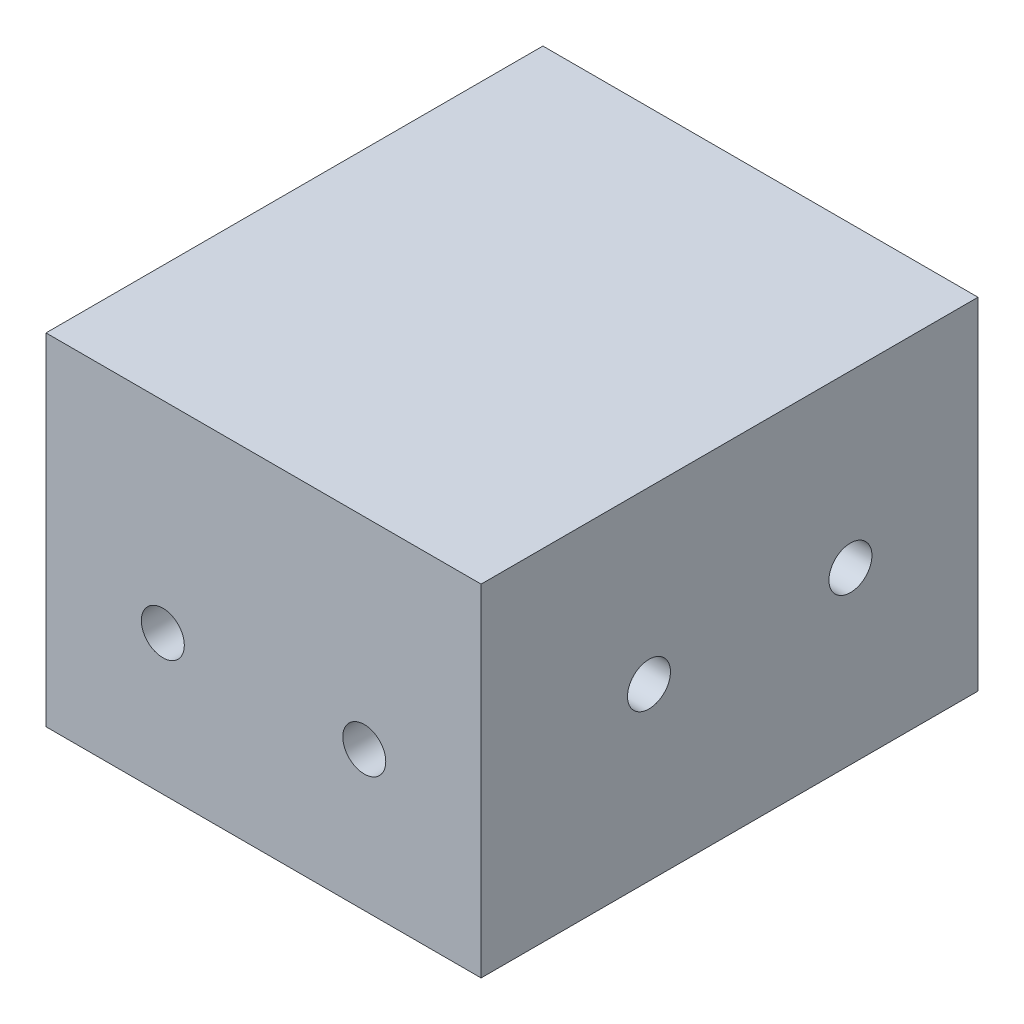
ISO-10303-21;
HEADER;
FILE_DESCRIPTION(('STEP AP214'),'2;1');
FILE_NAME('part.step','',(''),(''),'','','');
FILE_SCHEMA(('AUTOMOTIVE_DESIGN { 1 0 10303 214 1 1 1 1 }'));
ENDSEC;
DATA;
#1=APPLICATION_CONTEXT('core data for automotive mechanical design processes');
#2=APPLICATION_PROTOCOL_DEFINITION('international standard','automotive_design',2000,#1);
#3=PRODUCT_CONTEXT('',#1,'mechanical');
#4=PRODUCT('Part','Part','',(#3));
#5=PRODUCT_RELATED_PRODUCT_CATEGORY('part','',(#4));
#6=PRODUCT_DEFINITION_FORMATION('','',#4);
#7=PRODUCT_DEFINITION_CONTEXT('part definition',#1,'design');
#8=PRODUCT_DEFINITION('design','',#6,#7);
#9=PRODUCT_DEFINITION_SHAPE('','',#8);
#10=(LENGTH_UNIT() NAMED_UNIT(*) SI_UNIT(.MILLI.,.METRE.));
#11=(NAMED_UNIT(*) PLANE_ANGLE_UNIT() SI_UNIT($,.RADIAN.));
#12=(NAMED_UNIT(*) SI_UNIT($,.STERADIAN.) SOLID_ANGLE_UNIT());
#13=UNCERTAINTY_MEASURE_WITH_UNIT(LENGTH_MEASURE(1.E-05),#10,'distance_accuracy_value','');
#14=(GEOMETRIC_REPRESENTATION_CONTEXT(3) GLOBAL_UNCERTAINTY_ASSIGNED_CONTEXT((#13)) GLOBAL_UNIT_ASSIGNED_CONTEXT((#10,
#11,#12)) REPRESENTATION_CONTEXT('',''));
#15=CARTESIAN_POINT('',(0.,0.,0.));
#16=DIRECTION('',(0.,0.,1.));
#17=DIRECTION('',(1.,0.,0.));
#18=AXIS2_PLACEMENT_3D('',#15,#16,#17);
#19=CARTESIAN_POINT('',(23.7,10.4,-0.001000000000001));
#20=DIRECTION('',(0.,0.,1.));
#21=DIRECTION('',(1.,0.,0.));
#22=AXIS2_PLACEMENT_3D('',#19,#20,#21);
#23=CYLINDRICAL_SURFACE('',#22,1.6);
#24=CARTESIAN_POINT('',(23.7,10.4,33.));
#25=DIRECTION('',(0.,0.,-1.));
#26=DIRECTION('',(-1.,0.,0.));
#27=AXIS2_PLACEMENT_3D('',#24,#25,#26);
#28=CIRCLE('',#27,1.6);
#29=CARTESIAN_POINT('',(22.1,10.4,33.));
#30=VERTEX_POINT('',#29);
#31=EDGE_CURVE('E69',#30,#30,#28,.F.);
#32=ORIENTED_EDGE('',*,*,#31,.F.);
#33=EDGE_LOOP('',(#32));
#34=FACE_BOUND('',#33,.T.);
#35=CARTESIAN_POINT('',(23.7,10.4,37.));
#36=DIRECTION('',(0.,0.,1.));
#37=DIRECTION('',(1.,0.,0.));
#38=AXIS2_PLACEMENT_3D('',#35,#36,#37);
#39=CIRCLE('',#38,1.6);
#40=CARTESIAN_POINT('',(25.3,10.4,37.));
#41=VERTEX_POINT('',#40);
#42=EDGE_CURVE('E233',#41,#41,#39,.T.);
#43=ORIENTED_EDGE('',*,*,#42,.T.);
#44=EDGE_LOOP('',(#43));
#45=FACE_BOUND('',#44,.T.);
#46=ADVANCED_FACE('F65',(#34,#45),#23,.F.);
#47=CARTESIAN_POINT('',(8.7,10.4,-0.001000000000001));
#48=DIRECTION('',(0.,0.,1.));
#49=DIRECTION('',(1.,0.,0.));
#50=AXIS2_PLACEMENT_3D('',#47,#48,#49);
#51=CYLINDRICAL_SURFACE('',#50,1.6);
#52=CARTESIAN_POINT('',(8.7,10.4,33.));
#53=DIRECTION('',(0.,0.,-1.));
#54=DIRECTION('',(-1.,0.,0.));
#55=AXIS2_PLACEMENT_3D('',#52,#53,#54);
#56=CIRCLE('',#55,1.6);
#57=CARTESIAN_POINT('',(7.1,10.4,33.));
#58=VERTEX_POINT('',#57);
#59=EDGE_CURVE('E322',#58,#58,#56,.F.);
#60=ORIENTED_EDGE('',*,*,#59,.F.);
#61=EDGE_LOOP('',(#60));
#62=FACE_BOUND('',#61,.T.);
#63=CARTESIAN_POINT('',(8.7,10.4,37.));
#64=DIRECTION('',(0.,0.,1.));
#65=DIRECTION('',(1.,0.,0.));
#66=AXIS2_PLACEMENT_3D('',#63,#64,#65);
#67=CIRCLE('',#66,1.6);
#68=CARTESIAN_POINT('',(10.3,10.4,37.));
#69=VERTEX_POINT('',#68);
#70=EDGE_CURVE('E230',#69,#69,#67,.T.);
#71=ORIENTED_EDGE('',*,*,#70,.T.);
#72=EDGE_LOOP('',(#71));
#73=FACE_BOUND('',#72,.T.);
#74=ADVANCED_FACE('F399',(#62,#73),#51,.F.);
#75=CARTESIAN_POINT('',(0.,0.,35.));
#76=DIRECTION('',(0.,1.,0.));
#77=DIRECTION('',(0.,0.,1.));
#78=AXIS2_PLACEMENT_3D('',#75,#76,#77);
#79=PLANE('',#78);
#80=DIRECTION('',(1.,0.,0.));
#81=VECTOR('',#80,1.);
#82=CARTESIAN_POINT('',(0.,0.,0.));
#83=LINE('',#82,#81);
#84=CARTESIAN_POINT('',(0.,0.,0.));
#85=VERTEX_POINT('',#84);
#86=CARTESIAN_POINT('',(32.4,0.,0.));
#87=VERTEX_POINT('',#86);
#88=EDGE_CURVE('E384',#85,#87,#83,.T.);
#89=ORIENTED_EDGE('',*,*,#88,.T.);
#90=DIRECTION('',(0.,0.,-1.));
#91=VECTOR('',#90,1.);
#92=CARTESIAN_POINT('',(32.4,0.,35.));
#93=LINE('',#92,#91);
#94=CARTESIAN_POINT('',(32.4,0.,37.));
#95=VERTEX_POINT('',#94);
#96=EDGE_CURVE('E74',#95,#87,#93,.T.);
#97=ORIENTED_EDGE('',*,*,#96,.F.);
#98=DIRECTION('',(1.,0.,0.));
#99=VECTOR('',#98,1.);
#100=CARTESIAN_POINT('',(0.,0.,37.));
#101=LINE('',#100,#99);
#102=CARTESIAN_POINT('',(0.,0.,37.));
#103=VERTEX_POINT('',#102);
#104=EDGE_CURVE('E229',#103,#95,#101,.T.);
#105=ORIENTED_EDGE('',*,*,#104,.F.);
#106=DIRECTION('',(0.,0.,-1.));
#107=VECTOR('',#106,1.);
#108=CARTESIAN_POINT('',(0.,0.,35.));
#109=LINE('',#108,#107);
#110=EDGE_CURVE('E12',#103,#85,#109,.T.);
#111=ORIENTED_EDGE('',*,*,#110,.T.);
#112=EDGE_LOOP('',(#89,#97,#105,#111));
#113=FACE_BOUND('',#112,.T.);
#114=DIRECTION('',(1.,0.,0.));
#115=VECTOR('',#114,1.);
#116=CARTESIAN_POINT('',(0.,0.,4.));
#117=LINE('',#116,#115);
#118=CARTESIAN_POINT('',(4.,0.,4.));
#119=VERTEX_POINT('',#118);
#120=CARTESIAN_POINT('',(28.4,0.,4.));
#121=VERTEX_POINT('',#120);
#122=EDGE_CURVE('E355',#119,#121,#117,.T.);
#123=ORIENTED_EDGE('',*,*,#122,.F.);
#124=DIRECTION('',(0.,0.,-1.));
#125=VECTOR('',#124,1.);
#126=CARTESIAN_POINT('',(4.,0.,35.));
#127=LINE('',#126,#125);
#128=CARTESIAN_POINT('',(4.,0.,31.));
#129=VERTEX_POINT('',#128);
#130=EDGE_CURVE('E374',#129,#119,#127,.T.);
#131=ORIENTED_EDGE('',*,*,#130,.F.);
#132=DIRECTION('',(1.,0.,0.));
#133=VECTOR('',#132,1.);
#134=CARTESIAN_POINT('',(0.,0.,31.));
#135=LINE('',#134,#133);
#136=CARTESIAN_POINT('',(28.4,0.,31.));
#137=VERTEX_POINT('',#136);
#138=EDGE_CURVE('E358',#129,#137,#135,.T.);
#139=ORIENTED_EDGE('',*,*,#138,.T.);
#140=DIRECTION('',(0.,0.,-1.));
#141=VECTOR('',#140,1.);
#142=CARTESIAN_POINT('',(28.4,0.,35.));
#143=LINE('',#142,#141);
#144=EDGE_CURVE('E371',#137,#121,#143,.T.);
#145=ORIENTED_EDGE('',*,*,#144,.T.);
#146=EDGE_LOOP('',(#123,#131,#139,#145));
#147=FACE_BOUND('',#146,.T.);
#148=ADVANCED_FACE('F402',(#113,#147),#79,.F.);
#149=CARTESIAN_POINT('',(0.,0.,35.));
#150=DIRECTION('',(1.,0.,0.));
#151=DIRECTION('',(0.,0.,-1.));
#152=AXIS2_PLACEMENT_3D('',#149,#150,#151);
#153=PLANE('',#152);
#154=CARTESIAN_POINT('',(0.,12.7,9.5));
#155=DIRECTION('',(1.,0.,0.));
#156=DIRECTION('',(0.,0.,-1.));
#157=AXIS2_PLACEMENT_3D('',#154,#155,#156);
#158=CIRCLE('',#157,1.6);
#159=CARTESIAN_POINT('',(0.,12.7,7.9));
#160=VERTEX_POINT('',#159);
#161=EDGE_CURVE('E332',#160,#160,#158,.T.);
#162=ORIENTED_EDGE('',*,*,#161,.T.);
#163=EDGE_LOOP('',(#162));
#164=FACE_BOUND('',#163,.T.);
#165=CARTESIAN_POINT('',(0.,12.7,24.5));
#166=DIRECTION('',(1.,0.,0.));
#167=DIRECTION('',(0.,0.,-1.));
#168=AXIS2_PLACEMENT_3D('',#165,#166,#167);
#169=CIRCLE('',#168,1.6);
#170=CARTESIAN_POINT('',(0.,12.7,22.9));
#171=VERTEX_POINT('',#170);
#172=EDGE_CURVE('E343',#171,#171,#169,.T.);
#173=ORIENTED_EDGE('',*,*,#172,.T.);
#174=EDGE_LOOP('',(#173));
#175=FACE_BOUND('',#174,.T.);
#176=DIRECTION('',(0.,-1.,0.));
#177=VECTOR('',#176,1.);
#178=CARTESIAN_POINT('',(0.,0.,0.));
#179=LINE('',#178,#177);
#180=CARTESIAN_POINT('',(0.,25.4,0.));
#181=VERTEX_POINT('',#180);
#182=EDGE_CURVE('E376',#181,#85,#179,.T.);
#183=ORIENTED_EDGE('',*,*,#182,.T.);
#184=ORIENTED_EDGE('',*,*,#110,.F.);
#185=DIRECTION('',(0.,-1.,0.));
#186=VECTOR('',#185,1.);
#187=CARTESIAN_POINT('',(0.,25.4,37.));
#188=LINE('',#187,#186);
#189=CARTESIAN_POINT('',(0.,25.4,37.));
#190=VERTEX_POINT('',#189);
#191=EDGE_CURVE('E223',#190,#103,#188,.T.);
#192=ORIENTED_EDGE('',*,*,#191,.F.);
#193=DIRECTION('',(0.,0.,-1.));
#194=VECTOR('',#193,1.);
#195=CARTESIAN_POINT('',(0.,25.4,35.));
#196=LINE('',#195,#194);
#197=EDGE_CURVE('E214',#190,#181,#196,.T.);
#198=ORIENTED_EDGE('',*,*,#197,.T.);
#199=EDGE_LOOP('',(#183,#184,#192,#198));
#200=FACE_BOUND('',#199,.T.);
#201=ADVANCED_FACE('F67',(#164,#175,#200),#153,.F.);
#202=CARTESIAN_POINT('',(32.4,0.,35.));
#203=DIRECTION('',(-1.,0.,0.));
#204=DIRECTION('',(0.,0.,1.));
#205=AXIS2_PLACEMENT_3D('',#202,#203,#204);
#206=PLANE('',#205);
#207=CARTESIAN_POINT('',(32.4,12.7,9.5));
#208=DIRECTION('',(1.,0.,0.));
#209=DIRECTION('',(0.,0.,-1.));
#210=AXIS2_PLACEMENT_3D('',#207,#208,#209);
#211=CIRCLE('',#210,1.6);
#212=CARTESIAN_POINT('',(32.4,12.7,7.9));
#213=VERTEX_POINT('',#212);
#214=EDGE_CURVE('E336',#213,#213,#211,.T.);
#215=ORIENTED_EDGE('',*,*,#214,.F.);
#216=EDGE_LOOP('',(#215));
#217=FACE_BOUND('',#216,.T.);
#218=CARTESIAN_POINT('',(32.4,12.7,24.5));
#219=DIRECTION('',(1.,0.,0.));
#220=DIRECTION('',(0.,0.,-1.));
#221=AXIS2_PLACEMENT_3D('',#218,#219,#220);
#222=CIRCLE('',#221,1.6);
#223=CARTESIAN_POINT('',(32.4,12.7,22.9));
#224=VERTEX_POINT('',#223);
#225=EDGE_CURVE('E342',#224,#224,#222,.T.);
#226=ORIENTED_EDGE('',*,*,#225,.F.);
#227=EDGE_LOOP('',(#226));
#228=FACE_BOUND('',#227,.T.);
#229=DIRECTION('',(0.,1.,0.));
#230=VECTOR('',#229,1.);
#231=CARTESIAN_POINT('',(32.4,0.,0.));
#232=LINE('',#231,#230);
#233=CARTESIAN_POINT('',(32.4,25.4,0.));
#234=VERTEX_POINT('',#233);
#235=EDGE_CURVE('E211',#87,#234,#232,.T.);
#236=ORIENTED_EDGE('',*,*,#235,.T.);
#237=DIRECTION('',(0.,0.,-1.));
#238=VECTOR('',#237,1.);
#239=CARTESIAN_POINT('',(32.4,25.4,35.));
#240=LINE('',#239,#238);
#241=CARTESIAN_POINT('',(32.4,25.4,37.));
#242=VERTEX_POINT('',#241);
#243=EDGE_CURVE('E204',#242,#234,#240,.T.);
#244=ORIENTED_EDGE('',*,*,#243,.F.);
#245=DIRECTION('',(0.,1.,0.));
#246=VECTOR('',#245,1.);
#247=CARTESIAN_POINT('',(32.4,0.,37.));
#248=LINE('',#247,#246);
#249=EDGE_CURVE('E209',#95,#242,#248,.T.);
#250=ORIENTED_EDGE('',*,*,#249,.F.);
#251=ORIENTED_EDGE('',*,*,#96,.T.);
#252=EDGE_LOOP('',(#236,#244,#250,#251));
#253=FACE_BOUND('',#252,.T.);
#254=ADVANCED_FACE('F206',(#217,#228,#253),#206,.F.);
#255=CARTESIAN_POINT('',(0.,25.4,35.));
#256=DIRECTION('',(0.,-1.,0.));
#257=DIRECTION('',(0.,0.,-1.));
#258=AXIS2_PLACEMENT_3D('',#255,#256,#257);
#259=PLANE('',#258);
#260=DIRECTION('',(-1.,0.,0.));
#261=VECTOR('',#260,1.);
#262=CARTESIAN_POINT('',(0.,25.4,0.));
#263=LINE('',#262,#261);
#264=EDGE_CURVE('E387',#234,#181,#263,.T.);
#265=ORIENTED_EDGE('',*,*,#264,.T.);
#266=ORIENTED_EDGE('',*,*,#197,.F.);
#267=DIRECTION('',(-1.,0.,0.));
#268=VECTOR('',#267,1.);
#269=CARTESIAN_POINT('',(32.4,25.4,37.));
#270=LINE('',#269,#268);
#271=EDGE_CURVE('E217',#242,#190,#270,.T.);
#272=ORIENTED_EDGE('',*,*,#271,.F.);
#273=ORIENTED_EDGE('',*,*,#243,.T.);
#274=EDGE_LOOP('',(#265,#266,#272,#273));
#275=FACE_BOUND('',#274,.T.);
#276=ADVANCED_FACE('F218',(#275),#259,.F.);
#277=CARTESIAN_POINT('',(0.,0.,0.));
#278=DIRECTION('',(0.,0.,-1.));
#279=DIRECTION('',(-1.,0.,0.));
#280=AXIS2_PLACEMENT_3D('',#277,#278,#279);
#281=PLANE('',#280);
#282=ORIENTED_EDGE('',*,*,#182,.F.);
#283=ORIENTED_EDGE('',*,*,#264,.F.);
#284=ORIENTED_EDGE('',*,*,#235,.F.);
#285=ORIENTED_EDGE('',*,*,#88,.F.);
#286=EDGE_LOOP('',(#282,#283,#284,#285));
#287=FACE_BOUND('',#286,.T.);
#288=ADVANCED_FACE('F442',(#287),#281,.T.);
#289=CARTESIAN_POINT('',(4.,0.,35.));
#290=DIRECTION('',(1.,0.,0.));
#291=DIRECTION('',(0.,0.,-1.));
#292=AXIS2_PLACEMENT_3D('',#289,#290,#291);
#293=PLANE('',#292);
#294=CARTESIAN_POINT('',(4.,12.7,9.5));
#295=DIRECTION('',(1.,0.,0.));
#296=DIRECTION('',(0.,0.,-1.));
#297=AXIS2_PLACEMENT_3D('',#294,#295,#296);
#298=CIRCLE('',#297,1.6);
#299=CARTESIAN_POINT('',(4.,12.7,7.9));
#300=VERTEX_POINT('',#299);
#301=EDGE_CURVE('E339',#300,#300,#298,.T.);
#302=ORIENTED_EDGE('',*,*,#301,.F.);
#303=EDGE_LOOP('',(#302));
#304=FACE_BOUND('',#303,.T.);
#305=CARTESIAN_POINT('',(4.,12.7,24.5));
#306=DIRECTION('',(1.,0.,0.));
#307=DIRECTION('',(0.,0.,-1.));
#308=AXIS2_PLACEMENT_3D('',#305,#306,#307);
#309=CIRCLE('',#308,1.6);
#310=CARTESIAN_POINT('',(4.,12.7,22.9));
#311=VERTEX_POINT('',#310);
#312=EDGE_CURVE('E349',#311,#311,#309,.T.);
#313=ORIENTED_EDGE('',*,*,#312,.F.);
#314=EDGE_LOOP('',(#313));
#315=FACE_BOUND('',#314,.T.);
#316=DIRECTION('',(0.,-1.,0.));
#317=VECTOR('',#316,1.);
#318=CARTESIAN_POINT('',(4.,0.,4.));
#319=LINE('',#318,#317);
#320=CARTESIAN_POINT('',(4.,21.4,4.));
#321=VERTEX_POINT('',#320);
#322=EDGE_CURVE('E352',#321,#119,#319,.T.);
#323=ORIENTED_EDGE('',*,*,#322,.F.);
#324=DIRECTION('',(0.,0.,-1.));
#325=VECTOR('',#324,1.);
#326=CARTESIAN_POINT('',(4.,21.4,35.));
#327=LINE('',#326,#325);
#328=CARTESIAN_POINT('',(4.,21.4,31.));
#329=VERTEX_POINT('',#328);
#330=EDGE_CURVE('E360',#329,#321,#327,.T.);
#331=ORIENTED_EDGE('',*,*,#330,.F.);
#332=DIRECTION('',(0.,-1.,0.));
#333=VECTOR('',#332,1.);
#334=CARTESIAN_POINT('',(4.,0.,31.));
#335=LINE('',#334,#333);
#336=EDGE_CURVE('E356',#329,#129,#335,.T.);
#337=ORIENTED_EDGE('',*,*,#336,.T.);
#338=ORIENTED_EDGE('',*,*,#130,.T.);
#339=EDGE_LOOP('',(#323,#331,#337,#338));
#340=FACE_BOUND('',#339,.T.);
#341=ADVANCED_FACE('F438',(#304,#315,#340),#293,.T.);
#342=CARTESIAN_POINT('',(28.4,0.,35.));
#343=DIRECTION('',(-1.,0.,0.));
#344=DIRECTION('',(0.,0.,1.));
#345=AXIS2_PLACEMENT_3D('',#342,#343,#344);
#346=PLANE('',#345);
#347=CARTESIAN_POINT('',(28.4,12.7,9.5));
#348=DIRECTION('',(-1.,0.,0.));
#349=DIRECTION('',(0.,0.,1.));
#350=AXIS2_PLACEMENT_3D('',#347,#348,#349);
#351=CIRCLE('',#350,1.6);
#352=CARTESIAN_POINT('',(28.4,12.7,11.1));
#353=VERTEX_POINT('',#352);
#354=EDGE_CURVE('E335',#353,#353,#351,.T.);
#355=ORIENTED_EDGE('',*,*,#354,.F.);
#356=EDGE_LOOP('',(#355));
#357=FACE_BOUND('',#356,.T.);
#358=CARTESIAN_POINT('',(28.4,12.7,24.5));
#359=DIRECTION('',(-1.,0.,0.));
#360=DIRECTION('',(0.,0.,1.));
#361=AXIS2_PLACEMENT_3D('',#358,#359,#360);
#362=CIRCLE('',#361,1.6);
#363=CARTESIAN_POINT('',(28.4,12.7,26.1));
#364=VERTEX_POINT('',#363);
#365=EDGE_CURVE('E346',#364,#364,#362,.T.);
#366=ORIENTED_EDGE('',*,*,#365,.F.);
#367=EDGE_LOOP('',(#366));
#368=FACE_BOUND('',#367,.T.);
#369=DIRECTION('',(0.,1.,0.));
#370=VECTOR('',#369,1.);
#371=CARTESIAN_POINT('',(28.4,0.,4.));
#372=LINE('',#371,#370);
#373=CARTESIAN_POINT('',(28.4,21.4,4.));
#374=VERTEX_POINT('',#373);
#375=EDGE_CURVE('E366',#121,#374,#372,.T.);
#376=ORIENTED_EDGE('',*,*,#375,.F.);
#377=ORIENTED_EDGE('',*,*,#144,.F.);
#378=DIRECTION('',(0.,1.,0.));
#379=VECTOR('',#378,1.);
#380=CARTESIAN_POINT('',(28.4,0.,31.));
#381=LINE('',#380,#379);
#382=CARTESIAN_POINT('',(28.4,21.4,31.));
#383=VERTEX_POINT('',#382);
#384=EDGE_CURVE('E368',#137,#383,#381,.T.);
#385=ORIENTED_EDGE('',*,*,#384,.T.);
#386=DIRECTION('',(0.,0.,-1.));
#387=VECTOR('',#386,1.);
#388=CARTESIAN_POINT('',(28.4,21.4,35.));
#389=LINE('',#388,#387);
#390=EDGE_CURVE('E363',#383,#374,#389,.T.);
#391=ORIENTED_EDGE('',*,*,#390,.T.);
#392=EDGE_LOOP('',(#376,#377,#385,#391));
#393=FACE_BOUND('',#392,.T.);
#394=ADVANCED_FACE('F441',(#357,#368,#393),#346,.T.);
#395=CARTESIAN_POINT('',(0.,21.4,35.));
#396=DIRECTION('',(0.,-1.,0.));
#397=DIRECTION('',(0.,0.,-1.));
#398=AXIS2_PLACEMENT_3D('',#395,#396,#397);
#399=PLANE('',#398);
#400=DIRECTION('',(-1.,0.,0.));
#401=VECTOR('',#400,1.);
#402=CARTESIAN_POINT('',(0.,21.4,4.));
#403=LINE('',#402,#401);
#404=EDGE_CURVE('E359',#374,#321,#403,.T.);
#405=ORIENTED_EDGE('',*,*,#404,.F.);
#406=ORIENTED_EDGE('',*,*,#390,.F.);
#407=DIRECTION('',(-1.,0.,0.));
#408=VECTOR('',#407,1.);
#409=CARTESIAN_POINT('',(0.,21.4,31.));
#410=LINE('',#409,#408);
#411=EDGE_CURVE('E364',#383,#329,#410,.T.);
#412=ORIENTED_EDGE('',*,*,#411,.T.);
#413=ORIENTED_EDGE('',*,*,#330,.T.);
#414=EDGE_LOOP('',(#405,#406,#412,#413));
#415=FACE_BOUND('',#414,.T.);
#416=ADVANCED_FACE('F446',(#415),#399,.T.);
#417=CARTESIAN_POINT('',(0.,0.,31.));
#418=DIRECTION('',(0.,0.,-1.));
#419=DIRECTION('',(-1.,0.,0.));
#420=AXIS2_PLACEMENT_3D('',#417,#418,#419);
#421=PLANE('',#420);
#422=DIRECTION('',(1.,0.,0.));
#423=VECTOR('',#422,1.);
#424=CARTESIAN_POINT('',(22.1122867597285,13.15,31.));
#425=LINE('',#424,#423);
#426=CARTESIAN_POINT('',(22.1122867597285,13.15,31.));
#427=VERTEX_POINT('',#426);
#428=CARTESIAN_POINT('',(25.2877132402715,13.15,31.));
#429=VERTEX_POINT('',#428);
#430=EDGE_CURVE('E82',#427,#429,#425,.T.);
#431=ORIENTED_EDGE('',*,*,#430,.F.);
#432=DIRECTION('',(0.499999999999999,0.866025403784439,0.));
#433=VECTOR('',#432,1.);
#434=CARTESIAN_POINT('',(20.5245735194571,10.4,31.));
#435=LINE('',#434,#433);
#436=CARTESIAN_POINT('',(20.5245735194571,10.4,31.));
#437=VERTEX_POINT('',#436);
#438=EDGE_CURVE('E243',#437,#427,#435,.T.);
#439=ORIENTED_EDGE('',*,*,#438,.F.);
#440=DIRECTION('',(-0.5,0.866025403784439,0.));
#441=VECTOR('',#440,1.);
#442=CARTESIAN_POINT('',(22.1122867597285,7.65000000000001,31.));
#443=LINE('',#442,#441);
#444=CARTESIAN_POINT('',(22.1122867597285,7.65000000000001,31.));
#445=VERTEX_POINT('',#444);
#446=EDGE_CURVE('E269',#445,#437,#443,.T.);
#447=ORIENTED_EDGE('',*,*,#446,.F.);
#448=DIRECTION('',(-1.,0.,0.));
#449=VECTOR('',#448,1.);
#450=CARTESIAN_POINT('',(25.2877132402715,7.65000000000001,31.));
#451=LINE('',#450,#449);
#452=CARTESIAN_POINT('',(25.2877132402715,7.65000000000001,31.));
#453=VERTEX_POINT('',#452);
#454=EDGE_CURVE('E266',#453,#445,#451,.T.);
#455=ORIENTED_EDGE('',*,*,#454,.F.);
#456=DIRECTION('',(-0.5,-0.866025403784439,0.));
#457=VECTOR('',#456,1.);
#458=CARTESIAN_POINT('',(26.8754264805429,10.4,31.));
#459=LINE('',#458,#457);
#460=CARTESIAN_POINT('',(26.8754264805429,10.4,31.));
#461=VERTEX_POINT('',#460);
#462=EDGE_CURVE('E263',#461,#453,#459,.T.);
#463=ORIENTED_EDGE('',*,*,#462,.F.);
#464=DIRECTION('',(0.500000000000001,-0.866025403784438,0.));
#465=VECTOR('',#464,1.);
#466=CARTESIAN_POINT('',(25.2877132402715,13.15,31.));
#467=LINE('',#466,#465);
#468=EDGE_CURVE('E260',#429,#461,#467,.T.);
#469=ORIENTED_EDGE('',*,*,#468,.F.);
#470=EDGE_LOOP('',(#431,#439,#447,#455,#463,#469));
#471=FACE_BOUND('',#470,.T.);
#472=DIRECTION('',(1.,0.,0.));
#473=VECTOR('',#472,1.);
#474=CARTESIAN_POINT('',(7.11228675972853,13.15,31.));
#475=LINE('',#474,#473);
#476=CARTESIAN_POINT('',(7.11228675972853,13.15,31.));
#477=VERTEX_POINT('',#476);
#478=CARTESIAN_POINT('',(10.2877132402715,13.15,31.));
#479=VERTEX_POINT('',#478);
#480=EDGE_CURVE('E90',#477,#479,#475,.T.);
#481=ORIENTED_EDGE('',*,*,#480,.F.);
#482=DIRECTION('',(0.499999999999999,0.866025403784439,0.));
#483=VECTOR('',#482,1.);
#484=CARTESIAN_POINT('',(5.52457351945706,10.4,31.));
#485=LINE('',#484,#483);
#486=CARTESIAN_POINT('',(5.52457351945706,10.4,31.));
#487=VERTEX_POINT('',#486);
#488=EDGE_CURVE('E289',#487,#477,#485,.T.);
#489=ORIENTED_EDGE('',*,*,#488,.F.);
#490=DIRECTION('',(-0.500000000000001,0.866025403784438,0.));
#491=VECTOR('',#490,1.);
#492=CARTESIAN_POINT('',(7.11228675972853,7.65,31.));
#493=LINE('',#492,#491);
#494=CARTESIAN_POINT('',(7.11228675972853,7.65,31.));
#495=VERTEX_POINT('',#494);
#496=EDGE_CURVE('E315',#495,#487,#493,.T.);
#497=ORIENTED_EDGE('',*,*,#496,.F.);
#498=DIRECTION('',(-1.,0.,0.));
#499=VECTOR('',#498,1.);
#500=CARTESIAN_POINT('',(10.2877132402715,7.65,31.));
#501=LINE('',#500,#499);
#502=CARTESIAN_POINT('',(10.2877132402715,7.65,31.));
#503=VERTEX_POINT('',#502);
#504=EDGE_CURVE('E312',#503,#495,#501,.T.);
#505=ORIENTED_EDGE('',*,*,#504,.F.);
#506=DIRECTION('',(-0.499999999999999,-0.866025403784439,0.));
#507=VECTOR('',#506,1.);
#508=CARTESIAN_POINT('',(11.8754264805429,10.4,31.));
#509=LINE('',#508,#507);
#510=CARTESIAN_POINT('',(11.8754264805429,10.4,31.));
#511=VERTEX_POINT('',#510);
#512=EDGE_CURVE('E309',#511,#503,#509,.T.);
#513=ORIENTED_EDGE('',*,*,#512,.F.);
#514=DIRECTION('',(0.5,-0.866025403784438,0.));
#515=VECTOR('',#514,1.);
#516=CARTESIAN_POINT('',(10.2877132402715,13.15,31.));
#517=LINE('',#516,#515);
#518=EDGE_CURVE('E306',#479,#511,#517,.T.);
#519=ORIENTED_EDGE('',*,*,#518,.F.);
#520=EDGE_LOOP('',(#481,#489,#497,#505,#513,#519));
#521=FACE_BOUND('',#520,.T.);
#522=ORIENTED_EDGE('',*,*,#336,.F.);
#523=ORIENTED_EDGE('',*,*,#411,.F.);
#524=ORIENTED_EDGE('',*,*,#384,.F.);
#525=ORIENTED_EDGE('',*,*,#138,.F.);
#526=EDGE_LOOP('',(#522,#523,#524,#525));
#527=FACE_BOUND('',#526,.T.);
#528=ADVANCED_FACE('F450',(#471,#521,#527),#421,.T.);
#529=CARTESIAN_POINT('',(0.,0.,4.));
#530=DIRECTION('',(0.,0.,-1.));
#531=DIRECTION('',(-1.,0.,0.));
#532=AXIS2_PLACEMENT_3D('',#529,#530,#531);
#533=PLANE('',#532);
#534=ORIENTED_EDGE('',*,*,#322,.T.);
#535=ORIENTED_EDGE('',*,*,#122,.T.);
#536=ORIENTED_EDGE('',*,*,#375,.T.);
#537=ORIENTED_EDGE('',*,*,#404,.T.);
#538=EDGE_LOOP('',(#534,#535,#536,#537));
#539=FACE_BOUND('',#538,.T.);
#540=ADVANCED_FACE('F436',(#539),#533,.F.);
#541=CARTESIAN_POINT('',(0.,12.7,24.5));
#542=DIRECTION('',(1.,0.,0.));
#543=DIRECTION('',(0.,0.,-1.));
#544=AXIS2_PLACEMENT_3D('',#541,#542,#543);
#545=CYLINDRICAL_SURFACE('',#544,1.6);
#546=ORIENTED_EDGE('',*,*,#365,.T.);
#547=EDGE_LOOP('',(#546));
#548=FACE_BOUND('',#547,.T.);
#549=ORIENTED_EDGE('',*,*,#225,.T.);
#550=EDGE_LOOP('',(#549));
#551=FACE_BOUND('',#550,.T.);
#552=ADVANCED_FACE('F433',(#548,#551),#545,.F.);
#553=ORIENTED_EDGE('',*,*,#312,.T.);
#554=EDGE_LOOP('',(#553));
#555=FACE_BOUND('',#554,.T.);
#556=ORIENTED_EDGE('',*,*,#172,.F.);
#557=EDGE_LOOP('',(#556));
#558=FACE_BOUND('',#557,.T.);
#559=ADVANCED_FACE('F431',(#555,#558),#545,.F.);
#560=CARTESIAN_POINT('',(0.,12.7,9.5));
#561=DIRECTION('',(1.,0.,0.));
#562=DIRECTION('',(0.,0.,-1.));
#563=AXIS2_PLACEMENT_3D('',#560,#561,#562);
#564=CYLINDRICAL_SURFACE('',#563,1.6);
#565=ORIENTED_EDGE('',*,*,#354,.T.);
#566=EDGE_LOOP('',(#565));
#567=FACE_BOUND('',#566,.T.);
#568=ORIENTED_EDGE('',*,*,#214,.T.);
#569=EDGE_LOOP('',(#568));
#570=FACE_BOUND('',#569,.T.);
#571=ADVANCED_FACE('F427',(#567,#570),#564,.F.);
#572=ORIENTED_EDGE('',*,*,#301,.T.);
#573=EDGE_LOOP('',(#572));
#574=FACE_BOUND('',#573,.T.);
#575=ORIENTED_EDGE('',*,*,#161,.F.);
#576=EDGE_LOOP('',(#575));
#577=FACE_BOUND('',#576,.T.);
#578=ADVANCED_FACE('F430',(#574,#577),#564,.F.);
#579=CARTESIAN_POINT('',(0.,0.,33.));
#580=DIRECTION('',(0.,0.,-1.));
#581=DIRECTION('',(-1.,0.,0.));
#582=AXIS2_PLACEMENT_3D('',#579,#580,#581);
#583=PLANE('',#582);
#584=DIRECTION('',(1.,0.,0.));
#585=VECTOR('',#584,1.);
#586=CARTESIAN_POINT('',(7.11228675972853,13.15,33.));
#587=LINE('',#586,#585);
#588=CARTESIAN_POINT('',(7.11228675972853,13.15,33.));
#589=VERTEX_POINT('',#588);
#590=CARTESIAN_POINT('',(10.2877132402715,13.15,33.));
#591=VERTEX_POINT('',#590);
#592=EDGE_CURVE('E285',#589,#591,#587,.T.);
#593=ORIENTED_EDGE('',*,*,#592,.T.);
#594=DIRECTION('',(0.5,-0.866025403784438,0.));
#595=VECTOR('',#594,1.);
#596=CARTESIAN_POINT('',(10.2877132402715,13.15,33.));
#597=LINE('',#596,#595);
#598=CARTESIAN_POINT('',(11.8754264805429,10.4,33.));
#599=VERTEX_POINT('',#598);
#600=EDGE_CURVE('E288',#591,#599,#597,.T.);
#601=ORIENTED_EDGE('',*,*,#600,.T.);
#602=DIRECTION('',(-0.499999999999999,-0.866025403784439,0.));
#603=VECTOR('',#602,1.);
#604=CARTESIAN_POINT('',(11.8754264805429,10.4,33.));
#605=LINE('',#604,#603);
#606=CARTESIAN_POINT('',(10.2877132402715,7.65,33.));
#607=VERTEX_POINT('',#606);
#608=EDGE_CURVE('E292',#599,#607,#605,.T.);
#609=ORIENTED_EDGE('',*,*,#608,.T.);
#610=DIRECTION('',(-1.,0.,0.));
#611=VECTOR('',#610,1.);
#612=CARTESIAN_POINT('',(10.2877132402715,7.65,33.));
#613=LINE('',#612,#611);
#614=CARTESIAN_POINT('',(7.11228675972853,7.65,33.));
#615=VERTEX_POINT('',#614);
#616=EDGE_CURVE('E295',#607,#615,#613,.T.);
#617=ORIENTED_EDGE('',*,*,#616,.T.);
#618=DIRECTION('',(-0.500000000000001,0.866025403784438,0.));
#619=VECTOR('',#618,1.);
#620=CARTESIAN_POINT('',(7.11228675972853,7.65,33.));
#621=LINE('',#620,#619);
#622=CARTESIAN_POINT('',(5.52457351945706,10.4,33.));
#623=VERTEX_POINT('',#622);
#624=EDGE_CURVE('E298',#615,#623,#621,.T.);
#625=ORIENTED_EDGE('',*,*,#624,.T.);
#626=DIRECTION('',(0.499999999999999,0.866025403784439,0.));
#627=VECTOR('',#626,1.);
#628=CARTESIAN_POINT('',(5.52457351945706,10.4,33.));
#629=LINE('',#628,#627);
#630=EDGE_CURVE('E301',#623,#589,#629,.T.);
#631=ORIENTED_EDGE('',*,*,#630,.T.);
#632=EDGE_LOOP('',(#593,#601,#609,#617,#625,#631));
#633=FACE_BOUND('',#632,.T.);
#634=ORIENTED_EDGE('',*,*,#59,.T.);
#635=EDGE_LOOP('',(#634));
#636=FACE_BOUND('',#635,.T.);
#637=ADVANCED_FACE('F397',(#633,#636),#583,.T.);
#638=CARTESIAN_POINT('',(7.11228675972853,13.15,33.));
#639=DIRECTION('',(0.,1.,0.));
#640=DIRECTION('',(0.,0.,1.));
#641=AXIS2_PLACEMENT_3D('',#638,#639,#640);
#642=PLANE('',#641);
#643=ORIENTED_EDGE('',*,*,#480,.T.);
#644=DIRECTION('',(0.,0.,-1.));
#645=VECTOR('',#644,1.);
#646=CARTESIAN_POINT('',(10.2877132402715,13.15,33.));
#647=LINE('',#646,#645);
#648=EDGE_CURVE('E304',#591,#479,#647,.T.);
#649=ORIENTED_EDGE('',*,*,#648,.F.);
#650=ORIENTED_EDGE('',*,*,#592,.F.);
#651=DIRECTION('',(0.,0.,-1.));
#652=VECTOR('',#651,1.);
#653=CARTESIAN_POINT('',(7.11228675972853,13.15,33.));
#654=LINE('',#653,#652);
#655=EDGE_CURVE('E320',#589,#477,#654,.T.);
#656=ORIENTED_EDGE('',*,*,#655,.T.);
#657=EDGE_LOOP('',(#643,#649,#650,#656));
#658=FACE_BOUND('',#657,.T.);
#659=ADVANCED_FACE('F424',(#658),#642,.F.);
#660=CARTESIAN_POINT('',(5.52457351945706,10.4,33.));
#661=DIRECTION('',(-0.866025403784439,0.499999999999999,0.));
#662=DIRECTION('',(-0.499999999999999,-0.866025403784439,0.));
#663=AXIS2_PLACEMENT_3D('',#660,#661,#662);
#664=PLANE('',#663);
#665=ORIENTED_EDGE('',*,*,#488,.T.);
#666=ORIENTED_EDGE('',*,*,#655,.F.);
#667=ORIENTED_EDGE('',*,*,#630,.F.);
#668=DIRECTION('',(0.,0.,-1.));
#669=VECTOR('',#668,1.);
#670=CARTESIAN_POINT('',(5.52457351945706,10.4,33.));
#671=LINE('',#670,#669);
#672=EDGE_CURVE('E323',#623,#487,#671,.T.);
#673=ORIENTED_EDGE('',*,*,#672,.T.);
#674=EDGE_LOOP('',(#665,#666,#667,#673));
#675=FACE_BOUND('',#674,.T.);
#676=ADVANCED_FACE('F526',(#675),#664,.F.);
#677=CARTESIAN_POINT('',(7.11228675972853,7.65,33.));
#678=DIRECTION('',(-0.866025403784438,-0.500000000000001,0.));
#679=DIRECTION('',(0.500000000000001,-0.866025403784438,0.));
#680=AXIS2_PLACEMENT_3D('',#677,#678,#679);
#681=PLANE('',#680);
#682=ORIENTED_EDGE('',*,*,#496,.T.);
#683=ORIENTED_EDGE('',*,*,#672,.F.);
#684=ORIENTED_EDGE('',*,*,#624,.F.);
#685=DIRECTION('',(0.,0.,-1.));
#686=VECTOR('',#685,1.);
#687=CARTESIAN_POINT('',(7.11228675972853,7.65,33.));
#688=LINE('',#687,#686);
#689=EDGE_CURVE('E325',#615,#495,#688,.T.);
#690=ORIENTED_EDGE('',*,*,#689,.T.);
#691=EDGE_LOOP('',(#682,#683,#684,#690));
#692=FACE_BOUND('',#691,.T.);
#693=ADVANCED_FACE('F532',(#692),#681,.F.);
#694=CARTESIAN_POINT('',(10.2877132402715,7.65,33.));
#695=DIRECTION('',(0.,-1.,0.));
#696=DIRECTION('',(1.,0.,0.));
#697=AXIS2_PLACEMENT_3D('',#694,#695,#696);
#698=PLANE('',#697);
#699=ORIENTED_EDGE('',*,*,#504,.T.);
#700=ORIENTED_EDGE('',*,*,#689,.F.);
#701=ORIENTED_EDGE('',*,*,#616,.F.);
#702=DIRECTION('',(0.,0.,-1.));
#703=VECTOR('',#702,1.);
#704=CARTESIAN_POINT('',(10.2877132402715,7.65,33.));
#705=LINE('',#704,#703);
#706=EDGE_CURVE('E327',#607,#503,#705,.T.);
#707=ORIENTED_EDGE('',*,*,#706,.T.);
#708=EDGE_LOOP('',(#699,#700,#701,#707));
#709=FACE_BOUND('',#708,.T.);
#710=ADVANCED_FACE('F540',(#709),#698,.F.);
#711=CARTESIAN_POINT('',(11.8754264805429,10.4,33.));
#712=DIRECTION('',(0.866025403784439,-0.499999999999999,0.));
#713=DIRECTION('',(0.499999999999999,0.866025403784439,0.));
#714=AXIS2_PLACEMENT_3D('',#711,#712,#713);
#715=PLANE('',#714);
#716=ORIENTED_EDGE('',*,*,#512,.T.);
#717=ORIENTED_EDGE('',*,*,#706,.F.);
#718=ORIENTED_EDGE('',*,*,#608,.F.);
#719=DIRECTION('',(0.,0.,-1.));
#720=VECTOR('',#719,1.);
#721=CARTESIAN_POINT('',(11.8754264805429,10.4,33.));
#722=LINE('',#721,#720);
#723=EDGE_CURVE('E329',#599,#511,#722,.T.);
#724=ORIENTED_EDGE('',*,*,#723,.T.);
#725=EDGE_LOOP('',(#716,#717,#718,#724));
#726=FACE_BOUND('',#725,.T.);
#727=ADVANCED_FACE('F548',(#726),#715,.F.);
#728=CARTESIAN_POINT('',(10.2877132402715,13.15,33.));
#729=DIRECTION('',(0.866025403784438,0.5,0.));
#730=DIRECTION('',(-0.5,0.866025403784439,0.));
#731=AXIS2_PLACEMENT_3D('',#728,#729,#730);
#732=PLANE('',#731);
#733=ORIENTED_EDGE('',*,*,#518,.T.);
#734=ORIENTED_EDGE('',*,*,#723,.F.);
#735=ORIENTED_EDGE('',*,*,#600,.F.);
#736=ORIENTED_EDGE('',*,*,#648,.T.);
#737=EDGE_LOOP('',(#733,#734,#735,#736));
#738=FACE_BOUND('',#737,.T.);
#739=ADVANCED_FACE('F556',(#738),#732,.F.);
#740=CARTESIAN_POINT('',(0.,0.,33.));
#741=DIRECTION('',(0.,0.,-1.));
#742=DIRECTION('',(-1.,0.,0.));
#743=AXIS2_PLACEMENT_3D('',#740,#741,#742);
#744=PLANE('',#743);
#745=DIRECTION('',(1.,0.,0.));
#746=VECTOR('',#745,1.);
#747=CARTESIAN_POINT('',(22.1122867597285,13.15,33.));
#748=LINE('',#747,#746);
#749=CARTESIAN_POINT('',(22.1122867597285,13.15,33.));
#750=VERTEX_POINT('',#749);
#751=CARTESIAN_POINT('',(25.2877132402715,13.15,33.));
#752=VERTEX_POINT('',#751);
#753=EDGE_CURVE('E239',#750,#752,#748,.T.);
#754=ORIENTED_EDGE('',*,*,#753,.T.);
#755=DIRECTION('',(0.500000000000001,-0.866025403784438,0.));
#756=VECTOR('',#755,1.);
#757=CARTESIAN_POINT('',(25.2877132402715,13.15,33.));
#758=LINE('',#757,#756);
#759=CARTESIAN_POINT('',(26.8754264805429,10.4,33.));
#760=VERTEX_POINT('',#759);
#761=EDGE_CURVE('E242',#752,#760,#758,.T.);
#762=ORIENTED_EDGE('',*,*,#761,.T.);
#763=DIRECTION('',(-0.5,-0.866025403784439,0.));
#764=VECTOR('',#763,1.);
#765=CARTESIAN_POINT('',(26.8754264805429,10.4,33.));
#766=LINE('',#765,#764);
#767=CARTESIAN_POINT('',(25.2877132402715,7.65000000000001,33.));
#768=VERTEX_POINT('',#767);
#769=EDGE_CURVE('E246',#760,#768,#766,.T.);
#770=ORIENTED_EDGE('',*,*,#769,.T.);
#771=DIRECTION('',(-1.,0.,0.));
#772=VECTOR('',#771,1.);
#773=CARTESIAN_POINT('',(25.2877132402715,7.65000000000001,33.));
#774=LINE('',#773,#772);
#775=CARTESIAN_POINT('',(22.1122867597285,7.65000000000001,33.));
#776=VERTEX_POINT('',#775);
#777=EDGE_CURVE('E249',#768,#776,#774,.T.);
#778=ORIENTED_EDGE('',*,*,#777,.T.);
#779=DIRECTION('',(-0.5,0.866025403784439,0.));
#780=VECTOR('',#779,1.);
#781=CARTESIAN_POINT('',(22.1122867597285,7.65000000000001,33.));
#782=LINE('',#781,#780);
#783=CARTESIAN_POINT('',(20.5245735194571,10.4,33.));
#784=VERTEX_POINT('',#783);
#785=EDGE_CURVE('E252',#776,#784,#782,.T.);
#786=ORIENTED_EDGE('',*,*,#785,.T.);
#787=DIRECTION('',(0.499999999999999,0.866025403784439,0.));
#788=VECTOR('',#787,1.);
#789=CARTESIAN_POINT('',(20.5245735194571,10.4,33.));
#790=LINE('',#789,#788);
#791=EDGE_CURVE('E255',#784,#750,#790,.T.);
#792=ORIENTED_EDGE('',*,*,#791,.T.);
#793=EDGE_LOOP('',(#754,#762,#770,#778,#786,#792));
#794=FACE_BOUND('',#793,.T.);
#795=ORIENTED_EDGE('',*,*,#31,.T.);
#796=EDGE_LOOP('',(#795));
#797=FACE_BOUND('',#796,.T.);
#798=ADVANCED_FACE('F564',(#794,#797),#744,.T.);
#799=CARTESIAN_POINT('',(22.1122867597285,13.15,33.));
#800=DIRECTION('',(0.,1.,0.));
#801=DIRECTION('',(0.,0.,1.));
#802=AXIS2_PLACEMENT_3D('',#799,#800,#801);
#803=PLANE('',#802);
#804=ORIENTED_EDGE('',*,*,#430,.T.);
#805=DIRECTION('',(0.,0.,-1.));
#806=VECTOR('',#805,1.);
#807=CARTESIAN_POINT('',(25.2877132402715,13.15,33.));
#808=LINE('',#807,#806);
#809=EDGE_CURVE('E258',#752,#429,#808,.T.);
#810=ORIENTED_EDGE('',*,*,#809,.F.);
#811=ORIENTED_EDGE('',*,*,#753,.F.);
#812=DIRECTION('',(0.,0.,-1.));
#813=VECTOR('',#812,1.);
#814=CARTESIAN_POINT('',(22.1122867597285,13.15,33.));
#815=LINE('',#814,#813);
#816=EDGE_CURVE('E274',#750,#427,#815,.T.);
#817=ORIENTED_EDGE('',*,*,#816,.T.);
#818=EDGE_LOOP('',(#804,#810,#811,#817));
#819=FACE_BOUND('',#818,.T.);
#820=ADVANCED_FACE('F571',(#819),#803,.F.);
#821=CARTESIAN_POINT('',(20.5245735194571,10.4,33.));
#822=DIRECTION('',(-0.866025403784439,0.499999999999999,0.));
#823=DIRECTION('',(-0.499999999999999,-0.866025403784439,0.));
#824=AXIS2_PLACEMENT_3D('',#821,#822,#823);
#825=PLANE('',#824);
#826=ORIENTED_EDGE('',*,*,#438,.T.);
#827=ORIENTED_EDGE('',*,*,#816,.F.);
#828=ORIENTED_EDGE('',*,*,#791,.F.);
#829=DIRECTION('',(0.,0.,-1.));
#830=VECTOR('',#829,1.);
#831=CARTESIAN_POINT('',(20.5245735194571,10.4,33.));
#832=LINE('',#831,#830);
#833=EDGE_CURVE('E276',#784,#437,#832,.T.);
#834=ORIENTED_EDGE('',*,*,#833,.T.);
#835=EDGE_LOOP('',(#826,#827,#828,#834));
#836=FACE_BOUND('',#835,.T.);
#837=ADVANCED_FACE('F578',(#836),#825,.F.);
#838=CARTESIAN_POINT('',(22.1122867597285,7.65000000000001,33.));
#839=DIRECTION('',(-0.866025403784439,-0.5,0.));
#840=DIRECTION('',(0.5,-0.866025403784439,0.));
#841=AXIS2_PLACEMENT_3D('',#838,#839,#840);
#842=PLANE('',#841);
#843=ORIENTED_EDGE('',*,*,#446,.T.);
#844=ORIENTED_EDGE('',*,*,#833,.F.);
#845=ORIENTED_EDGE('',*,*,#785,.F.);
#846=DIRECTION('',(0.,0.,-1.));
#847=VECTOR('',#846,1.);
#848=CARTESIAN_POINT('',(22.1122867597285,7.65000000000001,33.));
#849=LINE('',#848,#847);
#850=EDGE_CURVE('E278',#776,#445,#849,.T.);
#851=ORIENTED_EDGE('',*,*,#850,.T.);
#852=EDGE_LOOP('',(#843,#844,#845,#851));
#853=FACE_BOUND('',#852,.T.);
#854=ADVANCED_FACE('F585',(#853),#842,.F.);
#855=CARTESIAN_POINT('',(25.2877132402715,7.65000000000001,33.));
#856=DIRECTION('',(0.,-1.,0.));
#857=DIRECTION('',(1.,0.,0.));
#858=AXIS2_PLACEMENT_3D('',#855,#856,#857);
#859=PLANE('',#858);
#860=ORIENTED_EDGE('',*,*,#454,.T.);
#861=ORIENTED_EDGE('',*,*,#850,.F.);
#862=ORIENTED_EDGE('',*,*,#777,.F.);
#863=DIRECTION('',(0.,0.,-1.));
#864=VECTOR('',#863,1.);
#865=CARTESIAN_POINT('',(25.2877132402715,7.65000000000001,33.));
#866=LINE('',#865,#864);
#867=EDGE_CURVE('E280',#768,#453,#866,.T.);
#868=ORIENTED_EDGE('',*,*,#867,.T.);
#869=EDGE_LOOP('',(#860,#861,#862,#868));
#870=FACE_BOUND('',#869,.T.);
#871=ADVANCED_FACE('F593',(#870),#859,.F.);
#872=CARTESIAN_POINT('',(26.8754264805429,10.4,33.));
#873=DIRECTION('',(0.866025403784439,-0.5,0.));
#874=DIRECTION('',(0.5,0.866025403784439,0.));
#875=AXIS2_PLACEMENT_3D('',#872,#873,#874);
#876=PLANE('',#875);
#877=ORIENTED_EDGE('',*,*,#462,.T.);
#878=ORIENTED_EDGE('',*,*,#867,.F.);
#879=ORIENTED_EDGE('',*,*,#769,.F.);
#880=DIRECTION('',(0.,0.,-1.));
#881=VECTOR('',#880,1.);
#882=CARTESIAN_POINT('',(26.8754264805429,10.4,33.));
#883=LINE('',#882,#881);
#884=EDGE_CURVE('E282',#760,#461,#883,.T.);
#885=ORIENTED_EDGE('',*,*,#884,.T.);
#886=EDGE_LOOP('',(#877,#878,#879,#885));
#887=FACE_BOUND('',#886,.T.);
#888=ADVANCED_FACE('F412',(#887),#876,.F.);
#889=CARTESIAN_POINT('',(25.2877132402715,13.15,33.));
#890=DIRECTION('',(0.866025403784438,0.500000000000001,0.));
#891=DIRECTION('',(-0.500000000000001,0.866025403784438,0.));
#892=AXIS2_PLACEMENT_3D('',#889,#890,#891);
#893=PLANE('',#892);
#894=ORIENTED_EDGE('',*,*,#468,.T.);
#895=ORIENTED_EDGE('',*,*,#884,.F.);
#896=ORIENTED_EDGE('',*,*,#761,.F.);
#897=ORIENTED_EDGE('',*,*,#809,.T.);
#898=EDGE_LOOP('',(#894,#895,#896,#897));
#899=FACE_BOUND('',#898,.T.);
#900=ADVANCED_FACE('F407',(#899),#893,.F.);
#901=CARTESIAN_POINT('',(0.,0.,37.));
#902=DIRECTION('',(0.,0.,1.));
#903=DIRECTION('',(1.,0.,0.));
#904=AXIS2_PLACEMENT_3D('',#901,#902,#903);
#905=PLANE('',#904);
#906=ORIENTED_EDGE('',*,*,#70,.F.);
#907=EDGE_LOOP('',(#906));
#908=FACE_BOUND('',#907,.T.);
#909=ORIENTED_EDGE('',*,*,#249,.T.);
#910=ORIENTED_EDGE('',*,*,#271,.T.);
#911=ORIENTED_EDGE('',*,*,#191,.T.);
#912=ORIENTED_EDGE('',*,*,#104,.T.);
#913=EDGE_LOOP('',(#909,#910,#911,#912));
#914=FACE_BOUND('',#913,.T.);
#915=ORIENTED_EDGE('',*,*,#42,.F.);
#916=EDGE_LOOP('',(#915));
#917=FACE_BOUND('',#916,.T.);
#918=ADVANCED_FACE('F226',(#908,#914,#917),#905,.T.);
#919=CLOSED_SHELL('',(#46,#74,#148,#201,#254,#276,#288,#341,#394,#416,#528,#540,#552,#559,#571,
#578,#637,#659,#676,#693,#710,#727,#739,#798,#820,#837,#854,#871,#888,#900,#918));
#920=MANIFOLD_SOLID_BREP('B2',#919);
#921=ADVANCED_BREP_SHAPE_REPRESENTATION('',(#18,#920),#14);
#922=SHAPE_DEFINITION_REPRESENTATION(#9,#921);
ENDSEC;
END-ISO-10303-21;
